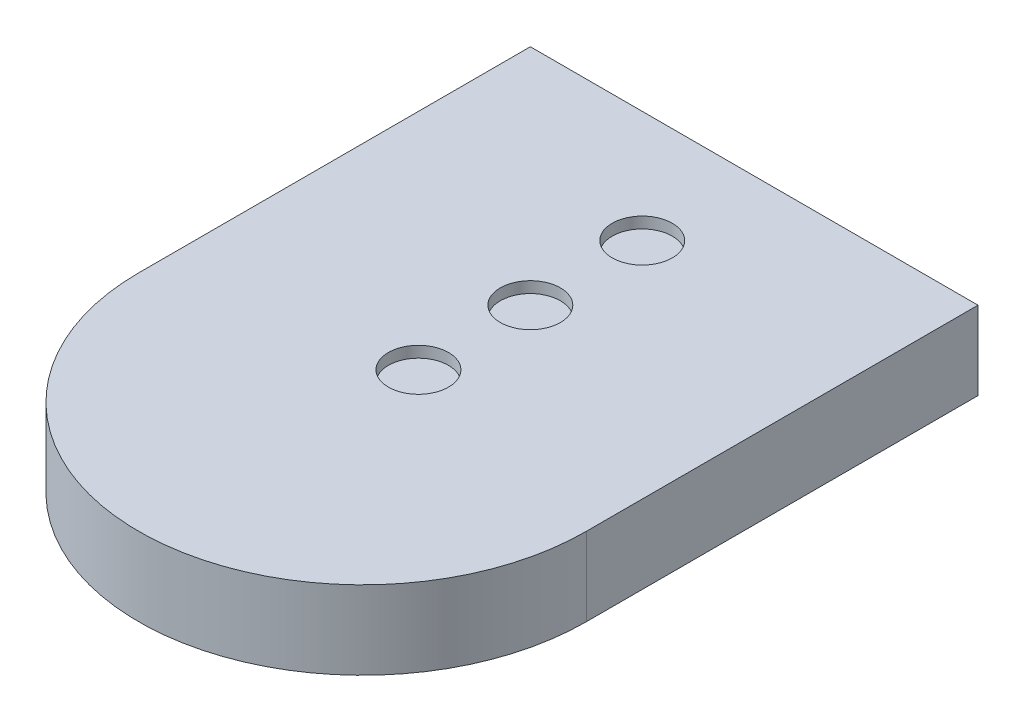
ISO-10303-21;
HEADER;
FILE_DESCRIPTION(('STEP AP214'),'2;1');
FILE_NAME('part.step','',(''),(''),'','','');
FILE_SCHEMA(('AUTOMOTIVE_DESIGN { 1 0 10303 214 1 1 1 1 }'));
ENDSEC;
DATA;
#1=APPLICATION_CONTEXT('core data for automotive mechanical design processes');
#2=APPLICATION_PROTOCOL_DEFINITION('international standard','automotive_design',2000,#1);
#3=PRODUCT_CONTEXT('',#1,'mechanical');
#4=PRODUCT('Part','Part','',(#3));
#5=PRODUCT_RELATED_PRODUCT_CATEGORY('part','',(#4));
#6=PRODUCT_DEFINITION_FORMATION('','',#4);
#7=PRODUCT_DEFINITION_CONTEXT('part definition',#1,'design');
#8=PRODUCT_DEFINITION('design','',#6,#7);
#9=PRODUCT_DEFINITION_SHAPE('','',#8);
#10=(LENGTH_UNIT() NAMED_UNIT(*) SI_UNIT(.MILLI.,.METRE.));
#11=(NAMED_UNIT(*) PLANE_ANGLE_UNIT() SI_UNIT($,.RADIAN.));
#12=(NAMED_UNIT(*) SI_UNIT($,.STERADIAN.) SOLID_ANGLE_UNIT());
#13=UNCERTAINTY_MEASURE_WITH_UNIT(LENGTH_MEASURE(1.E-05),#10,'distance_accuracy_value','');
#14=(GEOMETRIC_REPRESENTATION_CONTEXT(3) GLOBAL_UNCERTAINTY_ASSIGNED_CONTEXT((#13)) GLOBAL_UNIT_ASSIGNED_CONTEXT((#10,
#11,#12)) REPRESENTATION_CONTEXT('',''));
#15=CARTESIAN_POINT('',(0.,0.,0.));
#16=DIRECTION('',(0.,0.,1.));
#17=DIRECTION('',(1.,0.,0.));
#18=AXIS2_PLACEMENT_3D('',#15,#16,#17);
#19=CARTESIAN_POINT('',(20.,-6.99999999999996,30.));
#20=DIRECTION('',(0.,1.,0.));
#21=DIRECTION('',(0.,0.,1.));
#22=AXIS2_PLACEMENT_3D('',#19,#20,#21);
#23=CYLINDRICAL_SURFACE('',#22,2.68454328444719);
#24=CARTESIAN_POINT('',(20.,-6.,30.));
#25=DIRECTION('',(0.,-1.,0.));
#26=DIRECTION('',(0.,0.,-1.));
#27=AXIS2_PLACEMENT_3D('',#24,#25,#26);
#28=CIRCLE('',#27,2.68454328444719);
#29=CARTESIAN_POINT('',(20.,-6.,27.3154567155528));
#30=VERTEX_POINT('',#29);
#31=EDGE_CURVE('E173',#30,#30,#28,.F.);
#32=ORIENTED_EDGE('',*,*,#31,.T.);
#33=EDGE_LOOP('',(#32));
#34=FACE_BOUND('',#33,.T.);
#35=CARTESIAN_POINT('',(20.,-6.99999999999996,30.));
#36=DIRECTION('',(0.,1.,0.));
#37=DIRECTION('',(0.,0.,1.));
#38=AXIS2_PLACEMENT_3D('',#35,#36,#37);
#39=CIRCLE('',#38,2.68454328444719);
#40=CARTESIAN_POINT('',(20.,-6.99999999999996,32.6845432844472));
#41=VERTEX_POINT('',#40);
#42=EDGE_CURVE('E195',#41,#41,#39,.T.);
#43=ORIENTED_EDGE('',*,*,#42,.F.);
#44=EDGE_LOOP('',(#43));
#45=FACE_BOUND('',#44,.T.);
#46=ADVANCED_FACE('F41',(#34,#45),#23,.F.);
#47=CARTESIAN_POINT('',(20.,-6.99999999999996,20.));
#48=DIRECTION('',(0.,1.,0.));
#49=DIRECTION('',(0.,0.,1.));
#50=AXIS2_PLACEMENT_3D('',#47,#48,#49);
#51=CYLINDRICAL_SURFACE('',#50,2.68454328444719);
#52=CARTESIAN_POINT('',(20.,-6.,20.));
#53=DIRECTION('',(0.,-1.,0.));
#54=DIRECTION('',(0.,0.,-1.));
#55=AXIS2_PLACEMENT_3D('',#52,#53,#54);
#56=CIRCLE('',#55,2.68454328444719);
#57=CARTESIAN_POINT('',(20.,-6.,17.3154567155528));
#58=VERTEX_POINT('',#57);
#59=EDGE_CURVE('E169',#58,#58,#56,.F.);
#60=ORIENTED_EDGE('',*,*,#59,.T.);
#61=EDGE_LOOP('',(#60));
#62=FACE_BOUND('',#61,.T.);
#63=CARTESIAN_POINT('',(20.,-6.99999999999996,20.));
#64=DIRECTION('',(0.,1.,0.));
#65=DIRECTION('',(0.,0.,1.));
#66=AXIS2_PLACEMENT_3D('',#63,#64,#65);
#67=CIRCLE('',#66,2.68454328444719);
#68=CARTESIAN_POINT('',(20.,-6.99999999999996,22.6845432844472));
#69=VERTEX_POINT('',#68);
#70=EDGE_CURVE('E187',#69,#69,#67,.T.);
#71=ORIENTED_EDGE('',*,*,#70,.F.);
#72=EDGE_LOOP('',(#71));
#73=FACE_BOUND('',#72,.T.);
#74=ADVANCED_FACE('F280',(#62,#73),#51,.F.);
#75=CARTESIAN_POINT('',(20.,-6.99999999999996,10.));
#76=DIRECTION('',(0.,1.,0.));
#77=DIRECTION('',(0.,0.,1.));
#78=AXIS2_PLACEMENT_3D('',#75,#76,#77);
#79=CYLINDRICAL_SURFACE('',#78,2.68454328444719);
#80=CARTESIAN_POINT('',(20.,-6.,10.));
#81=DIRECTION('',(0.,-1.,0.));
#82=DIRECTION('',(0.,0.,-1.));
#83=AXIS2_PLACEMENT_3D('',#80,#81,#82);
#84=CIRCLE('',#83,2.68454328444719);
#85=CARTESIAN_POINT('',(20.,-6.,7.31545671555281));
#86=VERTEX_POINT('',#85);
#87=EDGE_CURVE('E46',#86,#86,#84,.F.);
#88=ORIENTED_EDGE('',*,*,#87,.T.);
#89=EDGE_LOOP('',(#88));
#90=FACE_BOUND('',#89,.T.);
#91=CARTESIAN_POINT('',(20.,-6.99999999999996,10.));
#92=DIRECTION('',(0.,1.,0.));
#93=DIRECTION('',(0.,0.,1.));
#94=AXIS2_PLACEMENT_3D('',#91,#92,#93);
#95=CIRCLE('',#94,2.68454328444719);
#96=CARTESIAN_POINT('',(20.,-6.99999999999996,12.6845432844472));
#97=VERTEX_POINT('',#96);
#98=EDGE_CURVE('E178',#97,#97,#95,.T.);
#99=ORIENTED_EDGE('',*,*,#98,.F.);
#100=EDGE_LOOP('',(#99));
#101=FACE_BOUND('',#100,.T.);
#102=ADVANCED_FACE('F276',(#90,#101),#79,.F.);
#103=CARTESIAN_POINT('',(20.,0.,35.));
#104=DIRECTION('',(0.,1.,0.));
#105=DIRECTION('',(0.,0.,1.));
#106=AXIS2_PLACEMENT_3D('',#103,#104,#105);
#107=CYLINDRICAL_SURFACE('',#106,20.);
#108=DIRECTION('',(0.,-1.,0.));
#109=VECTOR('',#108,1.);
#110=CARTESIAN_POINT('',(40.,0.,35.));
#111=LINE('',#110,#109);
#112=CARTESIAN_POINT('',(40.,0.,35.));
#113=VERTEX_POINT('',#112);
#114=CARTESIAN_POINT('',(40.,-7.,35.));
#115=VERTEX_POINT('',#114);
#116=EDGE_CURVE('E229',#113,#115,#111,.T.);
#117=ORIENTED_EDGE('',*,*,#116,.F.);
#118=CARTESIAN_POINT('',(20.,0.,35.));
#119=DIRECTION('',(0.,-1.,0.));
#120=DIRECTION('',(0.,0.,-1.));
#121=AXIS2_PLACEMENT_3D('',#118,#119,#120);
#122=CIRCLE('',#121,20.);
#123=CARTESIAN_POINT('',(0.,0.,35.));
#124=VERTEX_POINT('',#123);
#125=EDGE_CURVE('E52',#124,#113,#122,.F.);
#126=ORIENTED_EDGE('',*,*,#125,.F.);
#127=DIRECTION('',(0.,-1.,0.));
#128=VECTOR('',#127,1.);
#129=CARTESIAN_POINT('',(0.,0.,35.));
#130=LINE('',#129,#128);
#131=CARTESIAN_POINT('',(0.,-7.,35.));
#132=VERTEX_POINT('',#131);
#133=EDGE_CURVE('E233',#132,#124,#130,.F.);
#134=ORIENTED_EDGE('',*,*,#133,.F.);
#135=CARTESIAN_POINT('',(20.,-7.,35.));
#136=DIRECTION('',(0.,1.,0.));
#137=DIRECTION('',(0.,0.,1.));
#138=AXIS2_PLACEMENT_3D('',#135,#136,#137);
#139=CIRCLE('',#138,20.);
#140=EDGE_CURVE('E11',#115,#132,#139,.F.);
#141=ORIENTED_EDGE('',*,*,#140,.F.);
#142=EDGE_LOOP('',(#117,#126,#134,#141));
#143=FACE_BOUND('',#142,.T.);
#144=ADVANCED_FACE('F44',(#143),#107,.T.);
#145=CARTESIAN_POINT('',(0.,0.,55.));
#146=DIRECTION('',(0.,-1.,0.));
#147=DIRECTION('',(0.,0.,-1.));
#148=AXIS2_PLACEMENT_3D('',#145,#146,#147);
#149=PLANE('',#148);
#150=CARTESIAN_POINT('',(20.,0.,10.));
#151=DIRECTION('',(0.,1.,0.));
#152=DIRECTION('',(0.,0.,1.));
#153=AXIS2_PLACEMENT_3D('',#150,#151,#152);
#154=CIRCLE('',#153,2.68454328444719);
#155=CARTESIAN_POINT('',(20.,0.,12.6845432844472));
#156=VERTEX_POINT('',#155);
#157=EDGE_CURVE('E183',#156,#156,#154,.T.);
#158=ORIENTED_EDGE('',*,*,#157,.F.);
#159=EDGE_LOOP('',(#158));
#160=FACE_BOUND('',#159,.T.);
#161=CARTESIAN_POINT('',(20.,0.,20.));
#162=DIRECTION('',(0.,1.,0.));
#163=DIRECTION('',(0.,0.,1.));
#164=AXIS2_PLACEMENT_3D('',#161,#162,#163);
#165=CIRCLE('',#164,2.68454328444719);
#166=CARTESIAN_POINT('',(20.,0.,22.6845432844472));
#167=VERTEX_POINT('',#166);
#168=EDGE_CURVE('E191',#167,#167,#165,.T.);
#169=ORIENTED_EDGE('',*,*,#168,.F.);
#170=EDGE_LOOP('',(#169));
#171=FACE_BOUND('',#170,.T.);
#172=CARTESIAN_POINT('',(20.,0.,30.));
#173=DIRECTION('',(0.,1.,0.));
#174=DIRECTION('',(0.,0.,1.));
#175=AXIS2_PLACEMENT_3D('',#172,#173,#174);
#176=CIRCLE('',#175,2.68454328444719);
#177=CARTESIAN_POINT('',(20.,0.,32.6845432844472));
#178=VERTEX_POINT('',#177);
#179=EDGE_CURVE('E177',#178,#178,#176,.T.);
#180=ORIENTED_EDGE('',*,*,#179,.F.);
#181=EDGE_LOOP('',(#180));
#182=FACE_BOUND('',#181,.T.);
#183=DIRECTION('',(0.,0.,-1.));
#184=VECTOR('',#183,1.);
#185=CARTESIAN_POINT('',(0.,0.,55.));
#186=LINE('',#185,#184);
#187=CARTESIAN_POINT('',(0.,0.,0.));
#188=VERTEX_POINT('',#187);
#189=EDGE_CURVE('E226',#124,#188,#186,.T.);
#190=ORIENTED_EDGE('',*,*,#189,.F.);
#191=ORIENTED_EDGE('',*,*,#125,.T.);
#192=DIRECTION('',(0.,0.,-1.));
#193=VECTOR('',#192,1.);
#194=CARTESIAN_POINT('',(40.,0.,55.));
#195=LINE('',#194,#193);
#196=CARTESIAN_POINT('',(40.,0.,0.));
#197=VERTEX_POINT('',#196);
#198=EDGE_CURVE('E217',#113,#197,#195,.T.);
#199=ORIENTED_EDGE('',*,*,#198,.T.);
#200=DIRECTION('',(-1.,0.,0.));
#201=VECTOR('',#200,1.);
#202=CARTESIAN_POINT('',(0.,0.,0.));
#203=LINE('',#202,#201);
#204=EDGE_CURVE('E182',#197,#188,#203,.T.);
#205=ORIENTED_EDGE('',*,*,#204,.T.);
#206=EDGE_LOOP('',(#190,#191,#199,#205));
#207=FACE_BOUND('',#206,.T.);
#208=ADVANCED_FACE('F258',(#160,#171,#182,#207),#149,.F.);
#209=CARTESIAN_POINT('',(0.,0.,55.));
#210=DIRECTION('',(1.,0.,0.));
#211=DIRECTION('',(0.,1.,0.));
#212=AXIS2_PLACEMENT_3D('',#209,#210,#211);
#213=PLANE('',#212);
#214=DIRECTION('',(0.,0.,-1.));
#215=VECTOR('',#214,1.);
#216=CARTESIAN_POINT('',(0.,-7.,55.));
#217=LINE('',#216,#215);
#218=CARTESIAN_POINT('',(0.,-7.,0.));
#219=VERTEX_POINT('',#218);
#220=EDGE_CURVE('E223',#132,#219,#217,.T.);
#221=ORIENTED_EDGE('',*,*,#220,.F.);
#222=ORIENTED_EDGE('',*,*,#133,.T.);
#223=ORIENTED_EDGE('',*,*,#189,.T.);
#224=DIRECTION('',(0.,-1.,0.));
#225=VECTOR('',#224,1.);
#226=CARTESIAN_POINT('',(0.,0.,0.));
#227=LINE('',#226,#225);
#228=EDGE_CURVE('E205',#188,#219,#227,.T.);
#229=ORIENTED_EDGE('',*,*,#228,.T.);
#230=EDGE_LOOP('',(#221,#222,#223,#229));
#231=FACE_BOUND('',#230,.T.);
#232=ADVANCED_FACE('F261',(#231),#213,.F.);
#233=CARTESIAN_POINT('',(0.,-7.,55.));
#234=DIRECTION('',(0.,1.,0.));
#235=DIRECTION('',(0.,0.,1.));
#236=AXIS2_PLACEMENT_3D('',#233,#234,#235);
#237=PLANE('',#236);
#238=ORIENTED_EDGE('',*,*,#98,.T.);
#239=EDGE_LOOP('',(#238));
#240=FACE_BOUND('',#239,.T.);
#241=ORIENTED_EDGE('',*,*,#70,.T.);
#242=EDGE_LOOP('',(#241));
#243=FACE_BOUND('',#242,.T.);
#244=ORIENTED_EDGE('',*,*,#42,.T.);
#245=EDGE_LOOP('',(#244));
#246=FACE_BOUND('',#245,.T.);
#247=DIRECTION('',(0.,0.,-1.));
#248=VECTOR('',#247,1.);
#249=CARTESIAN_POINT('',(40.,-7.,55.));
#250=LINE('',#249,#248);
#251=CARTESIAN_POINT('',(40.,-7.,0.));
#252=VERTEX_POINT('',#251);
#253=EDGE_CURVE('E220',#115,#252,#250,.T.);
#254=ORIENTED_EDGE('',*,*,#253,.F.);
#255=ORIENTED_EDGE('',*,*,#140,.T.);
#256=ORIENTED_EDGE('',*,*,#220,.T.);
#257=DIRECTION('',(1.,0.,0.));
#258=VECTOR('',#257,1.);
#259=CARTESIAN_POINT('',(0.,-7.,0.));
#260=LINE('',#259,#258);
#261=EDGE_CURVE('E209',#219,#252,#260,.T.);
#262=ORIENTED_EDGE('',*,*,#261,.T.);
#263=EDGE_LOOP('',(#254,#255,#256,#262));
#264=FACE_BOUND('',#263,.T.);
#265=ADVANCED_FACE('F273',(#240,#243,#246,#264),#237,.F.);
#266=CARTESIAN_POINT('',(40.,-7.,55.));
#267=DIRECTION('',(-1.,0.,0.));
#268=DIRECTION('',(0.,0.,1.));
#269=AXIS2_PLACEMENT_3D('',#266,#267,#268);
#270=PLANE('',#269);
#271=ORIENTED_EDGE('',*,*,#198,.F.);
#272=ORIENTED_EDGE('',*,*,#116,.T.);
#273=ORIENTED_EDGE('',*,*,#253,.T.);
#274=DIRECTION('',(0.,1.,0.));
#275=VECTOR('',#274,1.);
#276=CARTESIAN_POINT('',(40.,-7.,0.));
#277=LINE('',#276,#275);
#278=EDGE_CURVE('E213',#252,#197,#277,.T.);
#279=ORIENTED_EDGE('',*,*,#278,.T.);
#280=EDGE_LOOP('',(#271,#272,#273,#279));
#281=FACE_BOUND('',#280,.T.);
#282=ADVANCED_FACE('F294',(#281),#270,.F.);
#283=CARTESIAN_POINT('',(0.,0.,0.));
#284=DIRECTION('',(0.,0.,1.));
#285=DIRECTION('',(1.,0.,0.));
#286=AXIS2_PLACEMENT_3D('',#283,#284,#285);
#287=PLANE('',#286);
#288=DIRECTION('',(1.,0.,0.));
#289=VECTOR('',#288,1.);
#290=CARTESIAN_POINT('',(30.,-1.,0.));
#291=LINE('',#290,#289);
#292=CARTESIAN_POINT('',(10.,-1.,0.));
#293=VERTEX_POINT('',#292);
#294=CARTESIAN_POINT('',(30.,-1.,0.));
#295=VERTEX_POINT('',#294);
#296=EDGE_CURVE('E146',#293,#295,#291,.T.);
#297=ORIENTED_EDGE('',*,*,#296,.F.);
#298=DIRECTION('',(0.,1.,0.));
#299=VECTOR('',#298,1.);
#300=CARTESIAN_POINT('',(10.,-1.,0.));
#301=LINE('',#300,#299);
#302=CARTESIAN_POINT('',(10.,-6.,0.));
#303=VERTEX_POINT('',#302);
#304=EDGE_CURVE('E60',#303,#293,#301,.T.);
#305=ORIENTED_EDGE('',*,*,#304,.F.);
#306=DIRECTION('',(-1.,0.,0.));
#307=VECTOR('',#306,1.);
#308=CARTESIAN_POINT('',(30.,-6.,0.));
#309=LINE('',#308,#307);
#310=CARTESIAN_POINT('',(30.,-6.,0.));
#311=VERTEX_POINT('',#310);
#312=EDGE_CURVE('E133',#311,#303,#309,.T.);
#313=ORIENTED_EDGE('',*,*,#312,.F.);
#314=DIRECTION('',(0.,-1.,0.));
#315=VECTOR('',#314,1.);
#316=CARTESIAN_POINT('',(30.,-1.,0.));
#317=LINE('',#316,#315);
#318=EDGE_CURVE('E137',#295,#311,#317,.T.);
#319=ORIENTED_EDGE('',*,*,#318,.F.);
#320=EDGE_LOOP('',(#297,#305,#313,#319));
#321=FACE_BOUND('',#320,.T.);
#322=ORIENTED_EDGE('',*,*,#204,.F.);
#323=ORIENTED_EDGE('',*,*,#278,.F.);
#324=ORIENTED_EDGE('',*,*,#261,.F.);
#325=ORIENTED_EDGE('',*,*,#228,.F.);
#326=EDGE_LOOP('',(#322,#323,#324,#325));
#327=FACE_BOUND('',#326,.T.);
#328=ADVANCED_FACE('F254',(#321,#327),#287,.F.);
#329=CARTESIAN_POINT('',(20.,-1.,30.));
#330=DIRECTION('',(0.,1.,0.));
#331=DIRECTION('',(0.,0.,1.));
#332=AXIS2_PLACEMENT_3D('',#329,#330,#331);
#333=CIRCLE('',#332,2.68454328444719);
#334=CARTESIAN_POINT('',(20.,-1.,32.6845432844472));
#335=VERTEX_POINT('',#334);
#336=EDGE_CURVE('E165',#335,#335,#333,.F.);
#337=ORIENTED_EDGE('',*,*,#336,.T.);
#338=EDGE_LOOP('',(#337));
#339=FACE_BOUND('',#338,.T.);
#340=ORIENTED_EDGE('',*,*,#179,.T.);
#341=EDGE_LOOP('',(#340));
#342=FACE_BOUND('',#341,.T.);
#343=ADVANCED_FACE('F250',(#339,#342),#23,.F.);
#344=CARTESIAN_POINT('',(20.,-1.,20.));
#345=DIRECTION('',(0.,1.,0.));
#346=DIRECTION('',(0.,0.,1.));
#347=AXIS2_PLACEMENT_3D('',#344,#345,#346);
#348=CIRCLE('',#347,2.68454328444719);
#349=CARTESIAN_POINT('',(20.,-1.,22.6845432844472));
#350=VERTEX_POINT('',#349);
#351=EDGE_CURVE('E161',#350,#350,#348,.F.);
#352=ORIENTED_EDGE('',*,*,#351,.T.);
#353=EDGE_LOOP('',(#352));
#354=FACE_BOUND('',#353,.T.);
#355=ORIENTED_EDGE('',*,*,#168,.T.);
#356=EDGE_LOOP('',(#355));
#357=FACE_BOUND('',#356,.T.);
#358=ADVANCED_FACE('F253',(#354,#357),#51,.F.);
#359=CARTESIAN_POINT('',(20.,-1.,10.));
#360=DIRECTION('',(0.,1.,0.));
#361=DIRECTION('',(0.,0.,1.));
#362=AXIS2_PLACEMENT_3D('',#359,#360,#361);
#363=CIRCLE('',#362,2.68454328444719);
#364=CARTESIAN_POINT('',(20.,-1.,12.6845432844472));
#365=VERTEX_POINT('',#364);
#366=EDGE_CURVE('E155',#365,#365,#363,.F.);
#367=ORIENTED_EDGE('',*,*,#366,.T.);
#368=EDGE_LOOP('',(#367));
#369=FACE_BOUND('',#368,.T.);
#370=ORIENTED_EDGE('',*,*,#157,.T.);
#371=EDGE_LOOP('',(#370));
#372=FACE_BOUND('',#371,.T.);
#373=ADVANCED_FACE('F241',(#369,#372),#79,.F.);
#374=CARTESIAN_POINT('',(30.,-6.,40.));
#375=DIRECTION('',(0.,-1.,0.));
#376=DIRECTION('',(0.,0.,-1.));
#377=AXIS2_PLACEMENT_3D('',#374,#375,#376);
#378=PLANE('',#377);
#379=ORIENTED_EDGE('',*,*,#59,.F.);
#380=EDGE_LOOP('',(#379));
#381=FACE_BOUND('',#380,.T.);
#382=ORIENTED_EDGE('',*,*,#312,.T.);
#383=DIRECTION('',(0.,0.,-1.));
#384=VECTOR('',#383,1.);
#385=CARTESIAN_POINT('',(10.,-6.,40.));
#386=LINE('',#385,#384);
#387=CARTESIAN_POINT('',(10.,-6.,40.));
#388=VERTEX_POINT('',#387);
#389=EDGE_CURVE('E152',#388,#303,#386,.T.);
#390=ORIENTED_EDGE('',*,*,#389,.F.);
#391=DIRECTION('',(-1.,0.,0.));
#392=VECTOR('',#391,1.);
#393=CARTESIAN_POINT('',(30.,-6.,40.));
#394=LINE('',#393,#392);
#395=CARTESIAN_POINT('',(30.,-6.,40.));
#396=VERTEX_POINT('',#395);
#397=EDGE_CURVE('E118',#396,#388,#394,.T.);
#398=ORIENTED_EDGE('',*,*,#397,.F.);
#399=DIRECTION('',(0.,0.,-1.));
#400=VECTOR('',#399,1.);
#401=CARTESIAN_POINT('',(30.,-6.,40.));
#402=LINE('',#401,#400);
#403=EDGE_CURVE('E156',#396,#311,#402,.T.);
#404=ORIENTED_EDGE('',*,*,#403,.T.);
#405=EDGE_LOOP('',(#382,#390,#398,#404));
#406=FACE_BOUND('',#405,.T.);
#407=ORIENTED_EDGE('',*,*,#87,.F.);
#408=EDGE_LOOP('',(#407));
#409=FACE_BOUND('',#408,.T.);
#410=ORIENTED_EDGE('',*,*,#31,.F.);
#411=EDGE_LOOP('',(#410));
#412=FACE_BOUND('',#411,.T.);
#413=ADVANCED_FACE('F245',(#381,#406,#409,#412),#378,.F.);
#414=CARTESIAN_POINT('',(30.,-1.,40.));
#415=DIRECTION('',(0.,1.,0.));
#416=DIRECTION('',(0.,0.,1.));
#417=AXIS2_PLACEMENT_3D('',#414,#415,#416);
#418=PLANE('',#417);
#419=ORIENTED_EDGE('',*,*,#351,.F.);
#420=EDGE_LOOP('',(#419));
#421=FACE_BOUND('',#420,.T.);
#422=ORIENTED_EDGE('',*,*,#296,.T.);
#423=DIRECTION('',(0.,0.,-1.));
#424=VECTOR('',#423,1.);
#425=CARTESIAN_POINT('',(30.,-1.,40.));
#426=LINE('',#425,#424);
#427=CARTESIAN_POINT('',(30.,-1.,40.));
#428=VERTEX_POINT('',#427);
#429=EDGE_CURVE('E117',#428,#295,#426,.T.);
#430=ORIENTED_EDGE('',*,*,#429,.F.);
#431=DIRECTION('',(1.,0.,0.));
#432=VECTOR('',#431,1.);
#433=CARTESIAN_POINT('',(30.,-1.,40.));
#434=LINE('',#433,#432);
#435=CARTESIAN_POINT('',(10.,-1.,40.));
#436=VERTEX_POINT('',#435);
#437=EDGE_CURVE('E121',#436,#428,#434,.T.);
#438=ORIENTED_EDGE('',*,*,#437,.F.);
#439=DIRECTION('',(0.,0.,-1.));
#440=VECTOR('',#439,1.);
#441=CARTESIAN_POINT('',(10.,-1.,40.));
#442=LINE('',#441,#440);
#443=EDGE_CURVE('E107',#436,#293,#442,.T.);
#444=ORIENTED_EDGE('',*,*,#443,.T.);
#445=EDGE_LOOP('',(#422,#430,#438,#444));
#446=FACE_BOUND('',#445,.T.);
#447=ORIENTED_EDGE('',*,*,#366,.F.);
#448=EDGE_LOOP('',(#447));
#449=FACE_BOUND('',#448,.T.);
#450=ORIENTED_EDGE('',*,*,#336,.F.);
#451=EDGE_LOOP('',(#450));
#452=FACE_BOUND('',#451,.T.);
#453=ADVANCED_FACE('F122',(#421,#446,#449,#452),#418,.F.);
#454=CARTESIAN_POINT('',(10.,-1.,40.));
#455=DIRECTION('',(-1.,0.,0.));
#456=DIRECTION('',(0.,0.,1.));
#457=AXIS2_PLACEMENT_3D('',#454,#455,#456);
#458=PLANE('',#457);
#459=ORIENTED_EDGE('',*,*,#304,.T.);
#460=ORIENTED_EDGE('',*,*,#443,.F.);
#461=DIRECTION('',(0.,1.,0.));
#462=VECTOR('',#461,1.);
#463=CARTESIAN_POINT('',(10.,-1.,40.));
#464=LINE('',#463,#462);
#465=EDGE_CURVE('E111',#388,#436,#464,.T.);
#466=ORIENTED_EDGE('',*,*,#465,.F.);
#467=ORIENTED_EDGE('',*,*,#389,.T.);
#468=EDGE_LOOP('',(#459,#460,#466,#467));
#469=FACE_BOUND('',#468,.T.);
#470=ADVANCED_FACE('F109',(#469),#458,.F.);
#471=CARTESIAN_POINT('',(30.,-1.,40.));
#472=DIRECTION('',(1.,0.,0.));
#473=DIRECTION('',(0.,1.,0.));
#474=AXIS2_PLACEMENT_3D('',#471,#472,#473);
#475=PLANE('',#474);
#476=ORIENTED_EDGE('',*,*,#318,.T.);
#477=ORIENTED_EDGE('',*,*,#403,.F.);
#478=DIRECTION('',(0.,-1.,0.));
#479=VECTOR('',#478,1.);
#480=CARTESIAN_POINT('',(30.,-1.,40.));
#481=LINE('',#480,#479);
#482=EDGE_CURVE('E128',#428,#396,#481,.T.);
#483=ORIENTED_EDGE('',*,*,#482,.F.);
#484=ORIENTED_EDGE('',*,*,#429,.T.);
#485=EDGE_LOOP('',(#476,#477,#483,#484));
#486=FACE_BOUND('',#485,.T.);
#487=ADVANCED_FACE('F352',(#486),#475,.F.);
#488=CARTESIAN_POINT('',(0.,0.,40.));
#489=DIRECTION('',(0.,0.,-1.));
#490=DIRECTION('',(-1.,0.,0.));
#491=AXIS2_PLACEMENT_3D('',#488,#489,#490);
#492=PLANE('',#491);
#493=ORIENTED_EDGE('',*,*,#465,.T.);
#494=ORIENTED_EDGE('',*,*,#437,.T.);
#495=ORIENTED_EDGE('',*,*,#482,.T.);
#496=ORIENTED_EDGE('',*,*,#397,.T.);
#497=EDGE_LOOP('',(#493,#494,#495,#496));
#498=FACE_BOUND('',#497,.T.);
#499=ADVANCED_FACE('F130',(#498),#492,.T.);
#500=CLOSED_SHELL('',(#46,#74,#102,#144,#208,#232,#265,#282,#328,#343,#358,#373,#413,#453,#470,
#487,#499));
#501=MANIFOLD_SOLID_BREP('B2',#500);
#502=ADVANCED_BREP_SHAPE_REPRESENTATION('',(#18,#501),#14);
#503=SHAPE_DEFINITION_REPRESENTATION(#9,#502);
ENDSEC;
END-ISO-10303-21;
